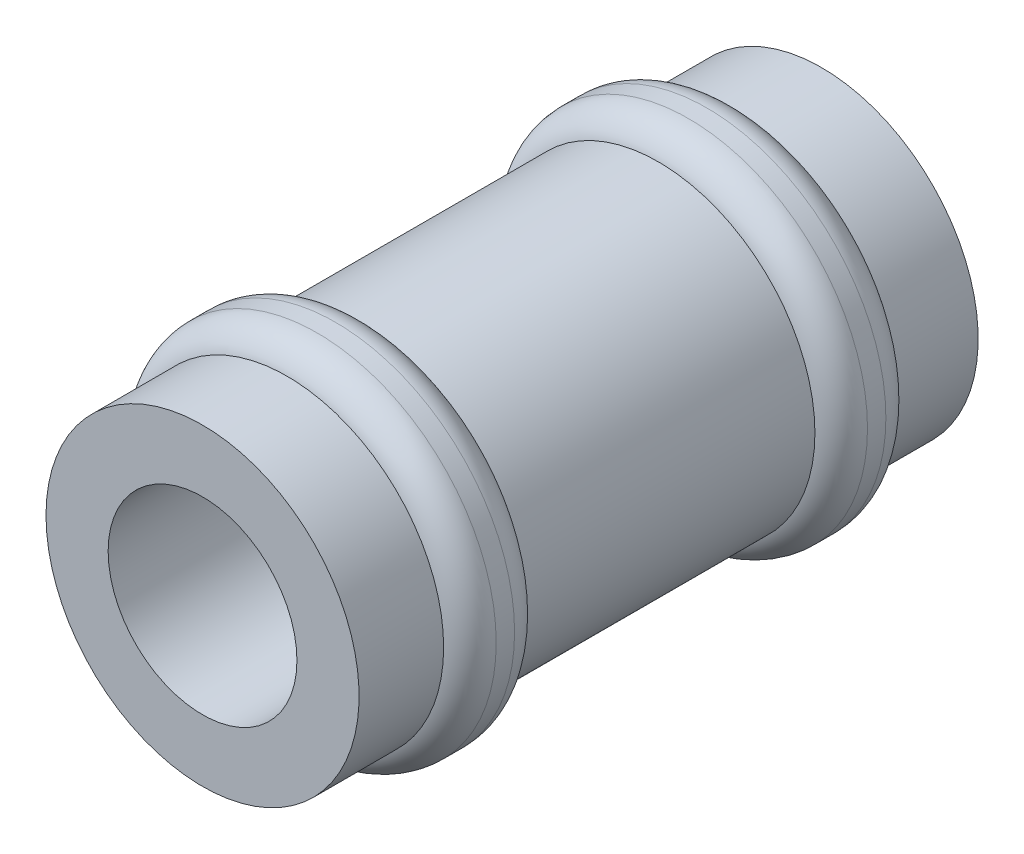
ISO-10303-21;
HEADER;
FILE_DESCRIPTION(('STEP AP214'),'2;1');
FILE_NAME('part.step','',(''),(''),'','','');
FILE_SCHEMA(('AUTOMOTIVE_DESIGN { 1 0 10303 214 1 1 1 1 }'));
ENDSEC;
DATA;
#1=APPLICATION_CONTEXT('core data for automotive mechanical design processes');
#2=APPLICATION_PROTOCOL_DEFINITION('international standard','automotive_design',2000,#1);
#3=PRODUCT_CONTEXT('',#1,'mechanical');
#4=PRODUCT('Part','Part','',(#3));
#5=PRODUCT_RELATED_PRODUCT_CATEGORY('part','',(#4));
#6=PRODUCT_DEFINITION_FORMATION('','',#4);
#7=PRODUCT_DEFINITION_CONTEXT('part definition',#1,'design');
#8=PRODUCT_DEFINITION('design','',#6,#7);
#9=PRODUCT_DEFINITION_SHAPE('','',#8);
#10=(LENGTH_UNIT() NAMED_UNIT(*) SI_UNIT(.MILLI.,.METRE.));
#11=(NAMED_UNIT(*) PLANE_ANGLE_UNIT() SI_UNIT($,.RADIAN.));
#12=(NAMED_UNIT(*) SI_UNIT($,.STERADIAN.) SOLID_ANGLE_UNIT());
#13=UNCERTAINTY_MEASURE_WITH_UNIT(LENGTH_MEASURE(1.E-05),#10,'distance_accuracy_value','');
#14=(GEOMETRIC_REPRESENTATION_CONTEXT(3) GLOBAL_UNCERTAINTY_ASSIGNED_CONTEXT((#13)) GLOBAL_UNIT_ASSIGNED_CONTEXT((#10,
#11,#12)) REPRESENTATION_CONTEXT('',''));
#15=CARTESIAN_POINT('',(0.,0.,0.));
#16=DIRECTION('',(0.,0.,1.));
#17=DIRECTION('',(1.,0.,0.));
#18=AXIS2_PLACEMENT_3D('',#15,#16,#17);
#19=CARTESIAN_POINT('',(0.,0.,54.));
#20=DIRECTION('',(0.,0.,-1.));
#21=DIRECTION('',(-1.,0.,0.));
#22=AXIS2_PLACEMENT_3D('',#19,#20,#21);
#23=CYLINDRICAL_SURFACE('',#22,5.0546);
#24=CARTESIAN_POINT('',(0.,0.,-3.59650077727779));
#25=DIRECTION('',(0.,0.,1.));
#26=DIRECTION('',(1.,0.,0.));
#27=AXIS2_PLACEMENT_3D('',#24,#25,#26);
#28=CIRCLE('',#27,5.0546);
#29=CARTESIAN_POINT('',(5.0546,0.,-3.59650077727779));
#30=VERTEX_POINT('',#29);
#31=EDGE_CURVE('E103',#30,#30,#28,.F.);
#32=ORIENTED_EDGE('',*,*,#31,.F.);
#33=EDGE_LOOP('',(#32));
#34=FACE_BOUND('',#33,.T.);
#35=CARTESIAN_POINT('',(0.,0.,5.85245797892387));
#36=DIRECTION('',(0.,0.,1.));
#37=DIRECTION('',(1.,0.,0.));
#38=AXIS2_PLACEMENT_3D('',#35,#36,#37);
#39=CIRCLE('',#38,5.0546);
#40=CARTESIAN_POINT('',(5.0546,0.,5.85245797892387));
#41=VERTEX_POINT('',#40);
#42=EDGE_CURVE('E86',#41,#41,#39,.T.);
#43=ORIENTED_EDGE('',*,*,#42,.F.);
#44=EDGE_LOOP('',(#43));
#45=FACE_BOUND('',#44,.T.);
#46=ADVANCED_FACE('F15',(#34,#45),#23,.T.);
#47=CARTESIAN_POINT('',(0.,0.,-4.56960590520591));
#48=DIRECTION('',(0.,0.,1.));
#49=DIRECTION('',(1.,0.,0.));
#50=AXIS2_PLACEMENT_3D('',#47,#48,#49);
#51=TOROIDAL_SURFACE('',#50,4.7625,1.016);
#52=CARTESIAN_POINT('',(0.,0.,-4.56960590520591));
#53=DIRECTION('',(0.,0.,-1.));
#54=DIRECTION('',(-1.,0.,0.));
#55=AXIS2_PLACEMENT_3D('',#52,#53,#54);
#56=CIRCLE('',#55,5.7785);
#57=CARTESIAN_POINT('',(-5.7785,0.,-4.56960590520591));
#58=VERTEX_POINT('',#57);
#59=EDGE_CURVE('E81',#58,#58,#56,.T.);
#60=ORIENTED_EDGE('',*,*,#59,.F.);
#61=EDGE_LOOP('',(#60));
#62=FACE_BOUND('',#61,.T.);
#63=ORIENTED_EDGE('',*,*,#31,.T.);
#64=EDGE_LOOP('',(#63));
#65=FACE_BOUND('',#64,.T.);
#66=ADVANCED_FACE('F96',(#62,#65),#51,.T.);
#67=CARTESIAN_POINT('',(0.,0.,6.82556310685199));
#68=DIRECTION('',(0.,0.,1.));
#69=DIRECTION('',(1.,0.,0.));
#70=AXIS2_PLACEMENT_3D('',#67,#68,#69);
#71=TOROIDAL_SURFACE('',#70,4.7625,1.016);
#72=ORIENTED_EDGE('',*,*,#42,.T.);
#73=EDGE_LOOP('',(#72));
#74=FACE_BOUND('',#73,.T.);
#75=CARTESIAN_POINT('',(0.,0.,6.82556310685199));
#76=DIRECTION('',(0.,0.,-1.));
#77=DIRECTION('',(-1.,0.,0.));
#78=AXIS2_PLACEMENT_3D('',#75,#76,#77);
#79=CIRCLE('',#78,5.7785);
#80=CARTESIAN_POINT('',(-5.7785,0.,6.82556310685199));
#81=VERTEX_POINT('',#80);
#82=EDGE_CURVE('E76',#81,#81,#79,.F.);
#83=ORIENTED_EDGE('',*,*,#82,.F.);
#84=EDGE_LOOP('',(#83));
#85=FACE_BOUND('',#84,.T.);
#86=ADVANCED_FACE('F93',(#74,#85),#71,.T.);
#87=CARTESIAN_POINT('',(0.,0.,54.));
#88=DIRECTION('',(0.,0.,-1.));
#89=DIRECTION('',(-1.,0.,0.));
#90=AXIS2_PLACEMENT_3D('',#87,#88,#89);
#91=CYLINDRICAL_SURFACE('',#90,5.7785);
#92=CARTESIAN_POINT('',(0.,0.,-5.16323689314801));
#93=DIRECTION('',(0.,0.,1.));
#94=DIRECTION('',(1.,0.,0.));
#95=AXIS2_PLACEMENT_3D('',#92,#93,#94);
#96=CIRCLE('',#95,5.7785);
#97=CARTESIAN_POINT('',(5.7785,0.,-5.16323689314801));
#98=VERTEX_POINT('',#97);
#99=EDGE_CURVE('E73',#98,#98,#96,.F.);
#100=ORIENTED_EDGE('',*,*,#99,.F.);
#101=EDGE_LOOP('',(#100));
#102=FACE_BOUND('',#101,.T.);
#103=ORIENTED_EDGE('',*,*,#59,.T.);
#104=EDGE_LOOP('',(#103));
#105=FACE_BOUND('',#104,.T.);
#106=ADVANCED_FACE('F95',(#102,#105),#91,.T.);
#107=CARTESIAN_POINT('',(0.,0.,54.));
#108=DIRECTION('',(0.,0.,-1.));
#109=DIRECTION('',(-1.,0.,0.));
#110=AXIS2_PLACEMENT_3D('',#107,#108,#109);
#111=CYLINDRICAL_SURFACE('',#110,5.7785);
#112=ORIENTED_EDGE('',*,*,#82,.T.);
#113=EDGE_LOOP('',(#112));
#114=FACE_BOUND('',#113,.T.);
#115=CARTESIAN_POINT('',(0.,0.,7.41919409479409));
#116=DIRECTION('',(0.,0.,1.));
#117=DIRECTION('',(1.,0.,0.));
#118=AXIS2_PLACEMENT_3D('',#115,#116,#117);
#119=CIRCLE('',#118,5.7785);
#120=CARTESIAN_POINT('',(5.7785,0.,7.41919409479409));
#121=VERTEX_POINT('',#120);
#122=EDGE_CURVE('E45',#121,#121,#119,.T.);
#123=ORIENTED_EDGE('',*,*,#122,.F.);
#124=EDGE_LOOP('',(#123));
#125=FACE_BOUND('',#124,.T.);
#126=ADVANCED_FACE('F67',(#114,#125),#111,.T.);
#127=CARTESIAN_POINT('',(0.,0.,-5.16323689314801));
#128=DIRECTION('',(0.,0.,1.));
#129=DIRECTION('',(1.,0.,0.));
#130=AXIS2_PLACEMENT_3D('',#127,#128,#129);
#131=TOROIDAL_SURFACE('',#130,4.7625,1.016);
#132=CARTESIAN_POINT('',(0.,0.,-6.13634202107613));
#133=DIRECTION('',(0.,0.,-1.));
#134=DIRECTION('',(-1.,0.,0.));
#135=AXIS2_PLACEMENT_3D('',#132,#133,#134);
#136=CIRCLE('',#135,5.0546);
#137=CARTESIAN_POINT('',(-5.0546,0.,-6.13634202107613));
#138=VERTEX_POINT('',#137);
#139=EDGE_CURVE('E40',#138,#138,#136,.T.);
#140=ORIENTED_EDGE('',*,*,#139,.F.);
#141=EDGE_LOOP('',(#140));
#142=FACE_BOUND('',#141,.T.);
#143=ORIENTED_EDGE('',*,*,#99,.T.);
#144=EDGE_LOOP('',(#143));
#145=FACE_BOUND('',#144,.T.);
#146=ADVANCED_FACE('F61',(#142,#145),#131,.T.);
#147=CARTESIAN_POINT('',(0.,0.,7.41919409479409));
#148=DIRECTION('',(0.,0.,1.));
#149=DIRECTION('',(1.,0.,0.));
#150=AXIS2_PLACEMENT_3D('',#147,#148,#149);
#151=TOROIDAL_SURFACE('',#150,4.7625,1.016);
#152=ORIENTED_EDGE('',*,*,#122,.T.);
#153=EDGE_LOOP('',(#152));
#154=FACE_BOUND('',#153,.T.);
#155=CARTESIAN_POINT('',(0.,0.,8.39229922272221));
#156=DIRECTION('',(0.,0.,-1.));
#157=DIRECTION('',(-1.,0.,0.));
#158=AXIS2_PLACEMENT_3D('',#155,#156,#157);
#159=CIRCLE('',#158,5.0546);
#160=CARTESIAN_POINT('',(-5.0546,0.,8.39229922272221));
#161=VERTEX_POINT('',#160);
#162=EDGE_CURVE('E36',#161,#161,#159,.F.);
#163=ORIENTED_EDGE('',*,*,#162,.F.);
#164=EDGE_LOOP('',(#163));
#165=FACE_BOUND('',#164,.T.);
#166=ADVANCED_FACE('F56',(#154,#165),#151,.T.);
#167=CARTESIAN_POINT('',(0.,0.,54.));
#168=DIRECTION('',(0.,0.,-1.));
#169=DIRECTION('',(-1.,0.,0.));
#170=AXIS2_PLACEMENT_3D('',#167,#168,#169);
#171=CYLINDRICAL_SURFACE('',#170,5.0546);
#172=CARTESIAN_POINT('',(0.,0.,-8.86692139917696));
#173=DIRECTION('',(0.,0.,-1.));
#174=DIRECTION('',(-1.,0.,0.));
#175=AXIS2_PLACEMENT_3D('',#172,#173,#174);
#176=CIRCLE('',#175,5.0546);
#177=CARTESIAN_POINT('',(-5.0546,0.,-8.86692139917696));
#178=VERTEX_POINT('',#177);
#179=EDGE_CURVE('E18',#178,#178,#176,.F.);
#180=ORIENTED_EDGE('',*,*,#179,.T.);
#181=EDGE_LOOP('',(#180));
#182=FACE_BOUND('',#181,.T.);
#183=ORIENTED_EDGE('',*,*,#139,.T.);
#184=EDGE_LOOP('',(#183));
#185=FACE_BOUND('',#184,.T.);
#186=ADVANCED_FACE('F60',(#182,#185),#171,.T.);
#187=CARTESIAN_POINT('',(0.,0.,54.));
#188=DIRECTION('',(0.,0.,-1.));
#189=DIRECTION('',(-1.,0.,0.));
#190=AXIS2_PLACEMENT_3D('',#187,#188,#189);
#191=CYLINDRICAL_SURFACE('',#190,5.0546);
#192=ORIENTED_EDGE('',*,*,#162,.T.);
#193=EDGE_LOOP('',(#192));
#194=FACE_BOUND('',#193,.T.);
#195=CARTESIAN_POINT('',(0.,0.,11.122878600823));
#196=DIRECTION('',(0.,0.,-1.));
#197=DIRECTION('',(-1.,0.,0.));
#198=AXIS2_PLACEMENT_3D('',#195,#196,#197);
#199=CIRCLE('',#198,5.0546);
#200=CARTESIAN_POINT('',(-5.0546,0.,11.122878600823));
#201=VERTEX_POINT('',#200);
#202=EDGE_CURVE('E27',#201,#201,#199,.T.);
#203=ORIENTED_EDGE('',*,*,#202,.T.);
#204=EDGE_LOOP('',(#203));
#205=FACE_BOUND('',#204,.T.);
#206=ADVANCED_FACE('F130',(#194,#205),#191,.T.);
#207=CARTESIAN_POINT('',(3.048,0.,-8.86692139917696));
#208=DIRECTION('',(0.,0.,1.));
#209=DIRECTION('',(1.,0.,0.));
#210=AXIS2_PLACEMENT_3D('',#207,#208,#209);
#211=PLANE('',#210);
#212=CARTESIAN_POINT('',(0.,0.,-8.86692139917696));
#213=DIRECTION('',(0.,0.,-1.));
#214=DIRECTION('',(-1.,0.,0.));
#215=AXIS2_PLACEMENT_3D('',#212,#213,#214);
#216=CIRCLE('',#215,3.048);
#217=CARTESIAN_POINT('',(-3.048,0.,-8.86692139917696));
#218=VERTEX_POINT('',#217);
#219=EDGE_CURVE('E22',#218,#218,#216,.F.);
#220=ORIENTED_EDGE('',*,*,#219,.T.);
#221=EDGE_LOOP('',(#220));
#222=FACE_BOUND('',#221,.T.);
#223=ORIENTED_EDGE('',*,*,#179,.F.);
#224=EDGE_LOOP('',(#223));
#225=FACE_BOUND('',#224,.T.);
#226=ADVANCED_FACE('F124',(#222,#225),#211,.F.);
#227=CARTESIAN_POINT('',(5.0546,0.,11.122878600823));
#228=DIRECTION('',(0.,0.,-1.));
#229=DIRECTION('',(-1.,0.,0.));
#230=AXIS2_PLACEMENT_3D('',#227,#228,#229);
#231=PLANE('',#230);
#232=ORIENTED_EDGE('',*,*,#202,.F.);
#233=EDGE_LOOP('',(#232));
#234=FACE_BOUND('',#233,.T.);
#235=CARTESIAN_POINT('',(0.,0.,11.122878600823));
#236=DIRECTION('',(0.,0.,-1.));
#237=DIRECTION('',(-1.,0.,0.));
#238=AXIS2_PLACEMENT_3D('',#235,#236,#237);
#239=CIRCLE('',#238,3.048);
#240=CARTESIAN_POINT('',(-3.048,0.,11.122878600823));
#241=VERTEX_POINT('',#240);
#242=EDGE_CURVE('E10',#241,#241,#239,.T.);
#243=ORIENTED_EDGE('',*,*,#242,.T.);
#244=EDGE_LOOP('',(#243));
#245=FACE_BOUND('',#244,.T.);
#246=ADVANCED_FACE('F118',(#234,#245),#231,.F.);
#247=CARTESIAN_POINT('',(0.,0.,54.));
#248=DIRECTION('',(0.,0.,-1.));
#249=DIRECTION('',(-1.,0.,0.));
#250=AXIS2_PLACEMENT_3D('',#247,#248,#249);
#251=CYLINDRICAL_SURFACE('',#250,3.048);
#252=ORIENTED_EDGE('',*,*,#242,.F.);
#253=EDGE_LOOP('',(#252));
#254=FACE_BOUND('',#253,.T.);
#255=ORIENTED_EDGE('',*,*,#219,.F.);
#256=EDGE_LOOP('',(#255));
#257=FACE_BOUND('',#256,.T.);
#258=ADVANCED_FACE('F116',(#254,#257),#251,.F.);
#259=CLOSED_SHELL('',(#46,#66,#86,#106,#126,#146,#166,#186,#206,#226,#246,#258));
#260=MANIFOLD_SOLID_BREP('B1',#259);
#261=ADVANCED_BREP_SHAPE_REPRESENTATION('',(#18,#260),#14);
#262=SHAPE_DEFINITION_REPRESENTATION(#9,#261);
ENDSEC;
END-ISO-10303-21;
